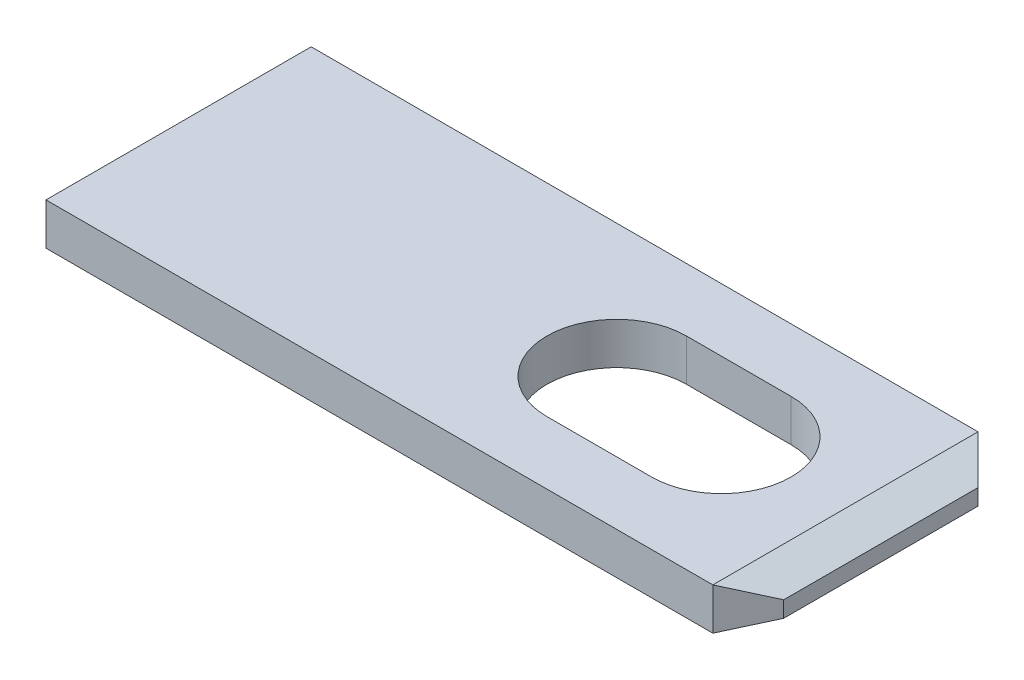
ISO-10303-21;
HEADER;
FILE_DESCRIPTION(('STEP AP214'),'2;1');
FILE_NAME('part.step','',(''),(''),'','','');
FILE_SCHEMA(('AUTOMOTIVE_DESIGN { 1 0 10303 214 1 1 1 1 }'));
ENDSEC;
DATA;
#1=APPLICATION_CONTEXT('core data for automotive mechanical design processes');
#2=APPLICATION_PROTOCOL_DEFINITION('international standard','automotive_design',2000,#1);
#3=PRODUCT_CONTEXT('',#1,'mechanical');
#4=PRODUCT('Part','Part','',(#3));
#5=PRODUCT_RELATED_PRODUCT_CATEGORY('part','',(#4));
#6=PRODUCT_DEFINITION_FORMATION('','',#4);
#7=PRODUCT_DEFINITION_CONTEXT('part definition',#1,'design');
#8=PRODUCT_DEFINITION('design','',#6,#7);
#9=PRODUCT_DEFINITION_SHAPE('','',#8);
#10=(LENGTH_UNIT() NAMED_UNIT(*) SI_UNIT(.MILLI.,.METRE.));
#11=(NAMED_UNIT(*) PLANE_ANGLE_UNIT() SI_UNIT($,.RADIAN.));
#12=(NAMED_UNIT(*) SI_UNIT($,.STERADIAN.) SOLID_ANGLE_UNIT());
#13=UNCERTAINTY_MEASURE_WITH_UNIT(LENGTH_MEASURE(1.E-05),#10,'distance_accuracy_value','');
#14=(GEOMETRIC_REPRESENTATION_CONTEXT(3) GLOBAL_UNCERTAINTY_ASSIGNED_CONTEXT((#13)) GLOBAL_UNIT_ASSIGNED_CONTEXT((#10,
#11,#12)) REPRESENTATION_CONTEXT('',''));
#15=CARTESIAN_POINT('',(0.,0.,0.));
#16=DIRECTION('',(0.,0.,1.));
#17=DIRECTION('',(1.,0.,0.));
#18=AXIS2_PLACEMENT_3D('',#15,#16,#17);
#19=CARTESIAN_POINT('',(10.063988,-0.115103120992769,1.89999999999998));
#20=DIRECTION('',(0.342020143325666,-0.939692620785909,0.));
#21=DIRECTION('',(0.939692620785909,0.342020143325666,0.));
#22=AXIS2_PLACEMENT_3D('',#19,#20,#21);
#23=PLANE('',#22);
#24=DIRECTION('',(-0.684791078771737,-0.249243569363954,-0.684791078771735));
#25=VECTOR('',#24,1.);
#26=CARTESIAN_POINT('',(10.063988,-0.115103120992769,-1.39200000000001));
#27=LINE('',#26,#25);
#28=CARTESIAN_POINT('',(10.063988,-0.115103120992769,-1.39200000000001));
#29=VERTEX_POINT('',#28);
#30=CARTESIAN_POINT('',(9.555988,-0.299999999999999,-1.90000000000001));
#31=VERTEX_POINT('',#30);
#32=EDGE_CURVE('E119',#29,#31,#27,.T.);
#33=ORIENTED_EDGE('',*,*,#32,.F.);
#34=DIRECTION('',(0.,0.,-1.));
#35=VECTOR('',#34,1.);
#36=CARTESIAN_POINT('',(10.063988,-0.115103120992769,1.89999999999998));
#37=LINE('',#36,#35);
#38=CARTESIAN_POINT('',(10.063988,-0.115103120992769,1.39199999999999));
#39=VERTEX_POINT('',#38);
#40=EDGE_CURVE('E143',#39,#29,#37,.T.);
#41=ORIENTED_EDGE('',*,*,#40,.F.);
#42=DIRECTION('',(0.684791078771737,0.249243569363954,-0.684791078771735));
#43=VECTOR('',#42,1.);
#44=CARTESIAN_POINT('',(9.555988,-0.3,1.89999999999999));
#45=LINE('',#44,#43);
#46=CARTESIAN_POINT('',(9.555988,-0.3,1.89999999999999));
#47=VERTEX_POINT('',#46);
#48=EDGE_CURVE('E140',#47,#39,#45,.T.);
#49=ORIENTED_EDGE('',*,*,#48,.F.);
#50=DIRECTION('',(0.,0.,1.));
#51=VECTOR('',#50,1.);
#52=CARTESIAN_POINT('',(9.555988,-0.3,-1.90000000000001));
#53=LINE('',#52,#51);
#54=EDGE_CURVE('E101',#47,#31,#53,.F.);
#55=ORIENTED_EDGE('',*,*,#54,.T.);
#56=EDGE_LOOP('',(#33,#41,#49,#55));
#57=FACE_BOUND('',#56,.T.);
#58=ADVANCED_FACE('F17',(#57),#23,.T.);
#59=CARTESIAN_POINT('',(10.063988,0.299999999999999,-1.39200000000001));
#60=DIRECTION('',(0.707106781186546,0.,-0.707106781186549));
#61=DIRECTION('',(-0.707106781186549,0.,-0.707106781186546));
#62=AXIS2_PLACEMENT_3D('',#59,#60,#61);
#63=PLANE('',#62);
#64=DIRECTION('',(0.,1.,0.));
#65=VECTOR('',#64,1.);
#66=CARTESIAN_POINT('',(9.555988,-0.3,-1.90000000000001));
#67=LINE('',#66,#65);
#68=CARTESIAN_POINT('',(9.555988,0.3,-1.90000000000001));
#69=VERTEX_POINT('',#68);
#70=EDGE_CURVE('E154',#31,#69,#67,.T.);
#71=ORIENTED_EDGE('',*,*,#70,.T.);
#72=DIRECTION('',(-0.684791078771737,0.249243569363953,-0.684791078771735));
#73=VECTOR('',#72,1.);
#74=CARTESIAN_POINT('',(10.063988,0.115103120992769,-1.39200000000001));
#75=LINE('',#74,#73);
#76=CARTESIAN_POINT('',(10.063988,0.115103120992769,-1.39200000000001));
#77=VERTEX_POINT('',#76);
#78=EDGE_CURVE('E169',#77,#69,#75,.T.);
#79=ORIENTED_EDGE('',*,*,#78,.F.);
#80=DIRECTION('',(0.,1.,0.));
#81=VECTOR('',#80,1.);
#82=CARTESIAN_POINT('',(10.063988,0.299999999999999,-1.39200000000001));
#83=LINE('',#82,#81);
#84=EDGE_CURVE('E142',#29,#77,#83,.T.);
#85=ORIENTED_EDGE('',*,*,#84,.F.);
#86=ORIENTED_EDGE('',*,*,#32,.T.);
#87=EDGE_LOOP('',(#71,#79,#85,#86));
#88=FACE_BOUND('',#87,.T.);
#89=ADVANCED_FACE('F151',(#88),#63,.T.);
#90=CARTESIAN_POINT('',(10.063988,0.299999999999999,1.89999999999998));
#91=DIRECTION('',(1.,0.,0.));
#92=DIRECTION('',(0.,0.,-1.));
#93=AXIS2_PLACEMENT_3D('',#90,#91,#92);
#94=PLANE('',#93);
#95=ORIENTED_EDGE('',*,*,#84,.T.);
#96=DIRECTION('',(0.,0.,1.));
#97=VECTOR('',#96,1.);
#98=CARTESIAN_POINT('',(10.063988,0.115103120992768,1.89999999999998));
#99=LINE('',#98,#97);
#100=CARTESIAN_POINT('',(10.063988,0.115103120992769,1.39199999999999));
#101=VERTEX_POINT('',#100);
#102=EDGE_CURVE('E180',#101,#77,#99,.F.);
#103=ORIENTED_EDGE('',*,*,#102,.F.);
#104=DIRECTION('',(0.,1.,0.));
#105=VECTOR('',#104,1.);
#106=CARTESIAN_POINT('',(10.063988,0.299999999999999,1.39199999999999));
#107=LINE('',#106,#105);
#108=EDGE_CURVE('E138',#39,#101,#107,.T.);
#109=ORIENTED_EDGE('',*,*,#108,.F.);
#110=ORIENTED_EDGE('',*,*,#40,.T.);
#111=EDGE_LOOP('',(#95,#103,#109,#110));
#112=FACE_BOUND('',#111,.T.);
#113=ADVANCED_FACE('F299',(#112),#94,.T.);
#114=CARTESIAN_POINT('',(10.063988,0.299999999999999,1.39199999999999));
#115=DIRECTION('',(0.707106781186546,0.,0.707106781186549));
#116=DIRECTION('',(0.707106781186549,0.,-0.707106781186546));
#117=AXIS2_PLACEMENT_3D('',#114,#115,#116);
#118=PLANE('',#117);
#119=ORIENTED_EDGE('',*,*,#108,.T.);
#120=DIRECTION('',(0.684791078771738,-0.249243569363953,-0.684791078771735));
#121=VECTOR('',#120,1.);
#122=CARTESIAN_POINT('',(9.555988,0.299999999999998,1.89999999999998));
#123=LINE('',#122,#121);
#124=CARTESIAN_POINT('',(9.555988,0.299999999999999,1.89999999999999));
#125=VERTEX_POINT('',#124);
#126=EDGE_CURVE('E177',#125,#101,#123,.T.);
#127=ORIENTED_EDGE('',*,*,#126,.F.);
#128=DIRECTION('',(0.,1.,0.));
#129=VECTOR('',#128,1.);
#130=CARTESIAN_POINT('',(9.555988,-0.3,1.89999999999998));
#131=LINE('',#130,#129);
#132=EDGE_CURVE('E34',#125,#47,#131,.F.);
#133=ORIENTED_EDGE('',*,*,#132,.T.);
#134=ORIENTED_EDGE('',*,*,#48,.T.);
#135=EDGE_LOOP('',(#119,#127,#133,#134));
#136=FACE_BOUND('',#135,.T.);
#137=ADVANCED_FACE('F291',(#136),#118,.T.);
#138=CARTESIAN_POINT('',(10.063988,-0.3,-1.90000000000001));
#139=DIRECTION('',(0.,1.,0.));
#140=DIRECTION('',(0.,0.,1.));
#141=AXIS2_PLACEMENT_3D('',#138,#139,#140);
#142=PLANE('',#141);
#143=ORIENTED_EDGE('',*,*,#54,.F.);
#144=DIRECTION('',(-1.,0.,0.));
#145=VECTOR('',#144,1.);
#146=CARTESIAN_POINT('',(10.063988,-0.3,1.89999999999998));
#147=LINE('',#146,#145);
#148=CARTESIAN_POINT('',(0.,-0.3,1.89999999999999));
#149=VERTEX_POINT('',#148);
#150=EDGE_CURVE('E129',#47,#149,#147,.T.);
#151=ORIENTED_EDGE('',*,*,#150,.T.);
#152=DIRECTION('',(0.,0.,-1.));
#153=VECTOR('',#152,1.);
#154=CARTESIAN_POINT('',(0.,-0.3,1.89999999999998));
#155=LINE('',#154,#153);
#156=CARTESIAN_POINT('',(0.,-0.3,-1.90000000000001));
#157=VERTEX_POINT('',#156);
#158=EDGE_CURVE('E109',#149,#157,#155,.T.);
#159=ORIENTED_EDGE('',*,*,#158,.T.);
#160=DIRECTION('',(1.,0.,0.));
#161=VECTOR('',#160,1.);
#162=CARTESIAN_POINT('',(10.063988,-0.3,-1.90000000000001));
#163=LINE('',#162,#161);
#164=EDGE_CURVE('E165',#157,#31,#163,.T.);
#165=ORIENTED_EDGE('',*,*,#164,.T.);
#166=EDGE_LOOP('',(#143,#151,#159,#165));
#167=FACE_BOUND('',#166,.T.);
#168=CARTESIAN_POINT('',(6.277988,-0.300000000000001,0.));
#169=DIRECTION('',(0.,1.,0.));
#170=DIRECTION('',(0.,0.,1.));
#171=AXIS2_PLACEMENT_3D('',#168,#169,#170);
#172=CIRCLE('',#171,1.);
#173=CARTESIAN_POINT('',(6.277988,-0.300000000000001,-1.));
#174=VERTEX_POINT('',#173);
#175=CARTESIAN_POINT('',(6.277988,-0.300000000000001,1.));
#176=VERTEX_POINT('',#175);
#177=EDGE_CURVE('E113',#174,#176,#172,.T.);
#178=ORIENTED_EDGE('',*,*,#177,.T.);
#179=DIRECTION('',(1.,0.,0.));
#180=VECTOR('',#179,1.);
#181=CARTESIAN_POINT('',(7.777988,-0.300000000000001,1.));
#182=LINE('',#181,#180);
#183=CARTESIAN_POINT('',(7.777988,-0.300000000000001,1.));
#184=VERTEX_POINT('',#183);
#185=EDGE_CURVE('E105',#176,#184,#182,.T.);
#186=ORIENTED_EDGE('',*,*,#185,.T.);
#187=CARTESIAN_POINT('',(7.777988,-0.3,0.));
#188=DIRECTION('',(0.,1.,0.));
#189=DIRECTION('',(0.,0.,1.));
#190=AXIS2_PLACEMENT_3D('',#187,#188,#189);
#191=CIRCLE('',#190,1.);
#192=CARTESIAN_POINT('',(7.777988,-0.3,-1.));
#193=VERTEX_POINT('',#192);
#194=EDGE_CURVE('E20',#184,#193,#191,.T.);
#195=ORIENTED_EDGE('',*,*,#194,.T.);
#196=DIRECTION('',(-1.,0.,0.));
#197=VECTOR('',#196,1.);
#198=CARTESIAN_POINT('',(6.277988,-0.300000000000001,-1.));
#199=LINE('',#198,#197);
#200=EDGE_CURVE('E121',#193,#174,#199,.T.);
#201=ORIENTED_EDGE('',*,*,#200,.T.);
#202=EDGE_LOOP('',(#178,#186,#195,#201));
#203=FACE_BOUND('',#202,.T.);
#204=ADVANCED_FACE('F111',(#167,#203),#142,.F.);
#205=CARTESIAN_POINT('',(7.777988,-0.300000000000001,0.));
#206=DIRECTION('',(0.,1.,0.));
#207=DIRECTION('',(0.,0.,1.));
#208=AXIS2_PLACEMENT_3D('',#205,#206,#207);
#209=CYLINDRICAL_SURFACE('',#208,1.);
#210=DIRECTION('',(0.,1.,0.));
#211=VECTOR('',#210,1.);
#212=CARTESIAN_POINT('',(7.777988,-0.300000000000001,-1.));
#213=LINE('',#212,#211);
#214=CARTESIAN_POINT('',(7.777988,0.3,-1.));
#215=VERTEX_POINT('',#214);
#216=EDGE_CURVE('E97',#215,#193,#213,.F.);
#217=ORIENTED_EDGE('',*,*,#216,.T.);
#218=ORIENTED_EDGE('',*,*,#194,.F.);
#219=DIRECTION('',(0.,1.,0.));
#220=VECTOR('',#219,1.);
#221=CARTESIAN_POINT('',(7.777988,-0.300000000000001,1.));
#222=LINE('',#221,#220);
#223=CARTESIAN_POINT('',(7.777988,0.3,1.));
#224=VERTEX_POINT('',#223);
#225=EDGE_CURVE('E95',#184,#224,#222,.T.);
#226=ORIENTED_EDGE('',*,*,#225,.T.);
#227=CARTESIAN_POINT('',(7.777988,0.3,0.));
#228=DIRECTION('',(0.,1.,0.));
#229=DIRECTION('',(0.,0.,1.));
#230=AXIS2_PLACEMENT_3D('',#227,#228,#229);
#231=CIRCLE('',#230,1.);
#232=EDGE_CURVE('E128',#224,#215,#231,.T.);
#233=ORIENTED_EDGE('',*,*,#232,.T.);
#234=EDGE_LOOP('',(#217,#218,#226,#233));
#235=FACE_BOUND('',#234,.T.);
#236=ADVANCED_FACE('F93',(#235),#209,.F.);
#237=CARTESIAN_POINT('',(6.277988,-0.300000000000001,-1.));
#238=DIRECTION('',(0.,0.,-1.));
#239=DIRECTION('',(-1.,0.,0.));
#240=AXIS2_PLACEMENT_3D('',#237,#238,#239);
#241=PLANE('',#240);
#242=DIRECTION('',(0.,1.,0.));
#243=VECTOR('',#242,1.);
#244=CARTESIAN_POINT('',(6.277988,-0.300000000000001,-1.));
#245=LINE('',#244,#243);
#246=CARTESIAN_POINT('',(6.277988,0.3,-1.));
#247=VERTEX_POINT('',#246);
#248=EDGE_CURVE('E123',#247,#174,#245,.F.);
#249=ORIENTED_EDGE('',*,*,#248,.T.);
#250=ORIENTED_EDGE('',*,*,#200,.F.);
#251=ORIENTED_EDGE('',*,*,#216,.F.);
#252=DIRECTION('',(1.,0.,0.));
#253=VECTOR('',#252,1.);
#254=CARTESIAN_POINT('',(10.063988,0.3,-1.));
#255=LINE('',#254,#253);
#256=EDGE_CURVE('E127',#215,#247,#255,.F.);
#257=ORIENTED_EDGE('',*,*,#256,.T.);
#258=EDGE_LOOP('',(#249,#250,#251,#257));
#259=FACE_BOUND('',#258,.T.);
#260=ADVANCED_FACE('F268',(#259),#241,.F.);
#261=CARTESIAN_POINT('',(6.277988,-0.300000000000001,0.));
#262=DIRECTION('',(0.,1.,0.));
#263=DIRECTION('',(0.,0.,1.));
#264=AXIS2_PLACEMENT_3D('',#261,#262,#263);
#265=CYLINDRICAL_SURFACE('',#264,1.);
#266=DIRECTION('',(0.,1.,0.));
#267=VECTOR('',#266,1.);
#268=CARTESIAN_POINT('',(6.277988,-0.300000000000001,1.));
#269=LINE('',#268,#267);
#270=CARTESIAN_POINT('',(6.277988,0.3,1.));
#271=VERTEX_POINT('',#270);
#272=EDGE_CURVE('E114',#271,#176,#269,.F.);
#273=ORIENTED_EDGE('',*,*,#272,.T.);
#274=ORIENTED_EDGE('',*,*,#177,.F.);
#275=ORIENTED_EDGE('',*,*,#248,.F.);
#276=CARTESIAN_POINT('',(6.277988,0.3,0.));
#277=DIRECTION('',(0.,1.,0.));
#278=DIRECTION('',(0.,0.,1.));
#279=AXIS2_PLACEMENT_3D('',#276,#277,#278);
#280=CIRCLE('',#279,1.);
#281=EDGE_CURVE('E124',#247,#271,#280,.T.);
#282=ORIENTED_EDGE('',*,*,#281,.T.);
#283=EDGE_LOOP('',(#273,#274,#275,#282));
#284=FACE_BOUND('',#283,.T.);
#285=ADVANCED_FACE('F214',(#284),#265,.F.);
#286=CARTESIAN_POINT('',(7.777988,-0.300000000000001,1.));
#287=DIRECTION('',(0.,0.,1.));
#288=DIRECTION('',(1.,0.,0.));
#289=AXIS2_PLACEMENT_3D('',#286,#287,#288);
#290=PLANE('',#289);
#291=ORIENTED_EDGE('',*,*,#225,.F.);
#292=ORIENTED_EDGE('',*,*,#185,.F.);
#293=ORIENTED_EDGE('',*,*,#272,.F.);
#294=DIRECTION('',(1.,0.,0.));
#295=VECTOR('',#294,1.);
#296=CARTESIAN_POINT('',(10.063988,0.3,1.));
#297=LINE('',#296,#295);
#298=EDGE_CURVE('E108',#271,#224,#297,.T.);
#299=ORIENTED_EDGE('',*,*,#298,.T.);
#300=EDGE_LOOP('',(#291,#292,#293,#299));
#301=FACE_BOUND('',#300,.T.);
#302=ADVANCED_FACE('F104',(#301),#290,.F.);
#303=CARTESIAN_POINT('',(0.,0.299999999999999,1.89999999999998));
#304=DIRECTION('',(1.,0.,0.));
#305=DIRECTION('',(0.,0.,-1.));
#306=AXIS2_PLACEMENT_3D('',#303,#304,#305);
#307=PLANE('',#306);
#308=DIRECTION('',(0.,0.,-1.));
#309=VECTOR('',#308,1.);
#310=CARTESIAN_POINT('',(0.,0.3,-1.90000000000001));
#311=LINE('',#310,#309);
#312=CARTESIAN_POINT('',(0.,0.3,1.89999999999999));
#313=VERTEX_POINT('',#312);
#314=CARTESIAN_POINT('',(0.,0.3,-1.90000000000001));
#315=VERTEX_POINT('',#314);
#316=EDGE_CURVE('E190',#313,#315,#311,.T.);
#317=ORIENTED_EDGE('',*,*,#316,.T.);
#318=DIRECTION('',(0.,1.,0.));
#319=VECTOR('',#318,1.);
#320=CARTESIAN_POINT('',(0.,-0.3,-1.90000000000001));
#321=LINE('',#320,#319);
#322=EDGE_CURVE('E171',#315,#157,#321,.F.);
#323=ORIENTED_EDGE('',*,*,#322,.T.);
#324=ORIENTED_EDGE('',*,*,#158,.F.);
#325=DIRECTION('',(0.,1.,0.));
#326=VECTOR('',#325,1.);
#327=CARTESIAN_POINT('',(0.,-0.3,1.89999999999998));
#328=LINE('',#327,#326);
#329=EDGE_CURVE('E183',#149,#313,#328,.T.);
#330=ORIENTED_EDGE('',*,*,#329,.T.);
#331=EDGE_LOOP('',(#317,#323,#324,#330));
#332=FACE_BOUND('',#331,.T.);
#333=ADVANCED_FACE('F205',(#332),#307,.F.);
#334=CARTESIAN_POINT('',(10.063988,-0.3,-1.90000000000001));
#335=DIRECTION('',(0.,0.,1.));
#336=DIRECTION('',(1.,0.,0.));
#337=AXIS2_PLACEMENT_3D('',#334,#335,#336);
#338=PLANE('',#337);
#339=ORIENTED_EDGE('',*,*,#70,.F.);
#340=ORIENTED_EDGE('',*,*,#164,.F.);
#341=ORIENTED_EDGE('',*,*,#322,.F.);
#342=DIRECTION('',(1.,0.,0.));
#343=VECTOR('',#342,1.);
#344=CARTESIAN_POINT('',(10.063988,0.3,-1.90000000000001));
#345=LINE('',#344,#343);
#346=EDGE_CURVE('E168',#315,#69,#345,.T.);
#347=ORIENTED_EDGE('',*,*,#346,.T.);
#348=EDGE_LOOP('',(#339,#340,#341,#347));
#349=FACE_BOUND('',#348,.T.);
#350=ADVANCED_FACE('F164',(#349),#338,.F.);
#351=CARTESIAN_POINT('',(10.063988,0.115103120992768,1.89999999999998));
#352=DIRECTION('',(0.342020143325666,0.939692620785909,0.));
#353=DIRECTION('',(-0.939692620785909,0.342020143325666,0.));
#354=AXIS2_PLACEMENT_3D('',#351,#352,#353);
#355=PLANE('',#354);
#356=ORIENTED_EDGE('',*,*,#126,.T.);
#357=ORIENTED_EDGE('',*,*,#102,.T.);
#358=ORIENTED_EDGE('',*,*,#78,.T.);
#359=DIRECTION('',(0.,0.,-1.));
#360=VECTOR('',#359,1.);
#361=CARTESIAN_POINT('',(9.555988,0.3,-1.90000000000001));
#362=LINE('',#361,#360);
#363=EDGE_CURVE('E26',#69,#125,#362,.F.);
#364=ORIENTED_EDGE('',*,*,#363,.T.);
#365=EDGE_LOOP('',(#356,#357,#358,#364));
#366=FACE_BOUND('',#365,.T.);
#367=ADVANCED_FACE('F196',(#366),#355,.T.);
#368=CARTESIAN_POINT('',(10.063988,-0.3,1.89999999999998));
#369=DIRECTION('',(0.,0.,-1.));
#370=DIRECTION('',(-1.,0.,0.));
#371=AXIS2_PLACEMENT_3D('',#368,#369,#370);
#372=PLANE('',#371);
#373=ORIENTED_EDGE('',*,*,#132,.F.);
#374=DIRECTION('',(1.,0.,0.));
#375=VECTOR('',#374,1.);
#376=CARTESIAN_POINT('',(10.063988,0.299999999999999,1.89999999999999));
#377=LINE('',#376,#375);
#378=EDGE_CURVE('E11',#125,#313,#377,.F.);
#379=ORIENTED_EDGE('',*,*,#378,.T.);
#380=ORIENTED_EDGE('',*,*,#329,.F.);
#381=ORIENTED_EDGE('',*,*,#150,.F.);
#382=EDGE_LOOP('',(#373,#379,#380,#381));
#383=FACE_BOUND('',#382,.T.);
#384=ADVANCED_FACE('F203',(#383),#372,.F.);
#385=CARTESIAN_POINT('',(10.063988,0.3,-1.90000000000001));
#386=DIRECTION('',(0.,-1.,0.));
#387=DIRECTION('',(0.,0.,-1.));
#388=AXIS2_PLACEMENT_3D('',#385,#386,#387);
#389=PLANE('',#388);
#390=ORIENTED_EDGE('',*,*,#363,.F.);
#391=ORIENTED_EDGE('',*,*,#346,.F.);
#392=ORIENTED_EDGE('',*,*,#316,.F.);
#393=ORIENTED_EDGE('',*,*,#378,.F.);
#394=EDGE_LOOP('',(#390,#391,#392,#393));
#395=FACE_BOUND('',#394,.T.);
#396=ORIENTED_EDGE('',*,*,#281,.F.);
#397=ORIENTED_EDGE('',*,*,#256,.F.);
#398=ORIENTED_EDGE('',*,*,#232,.F.);
#399=ORIENTED_EDGE('',*,*,#298,.F.);
#400=EDGE_LOOP('',(#396,#397,#398,#399));
#401=FACE_BOUND('',#400,.T.);
#402=ADVANCED_FACE('F200',(#395,#401),#389,.F.);
#403=CLOSED_SHELL('',(#58,#89,#113,#137,#204,#236,#260,#285,#302,#333,#350,#367,#384,#402));
#404=MANIFOLD_SOLID_BREP('B1',#403);
#405=ADVANCED_BREP_SHAPE_REPRESENTATION('',(#18,#404),#14);
#406=SHAPE_DEFINITION_REPRESENTATION(#9,#405);
ENDSEC;
END-ISO-10303-21;
